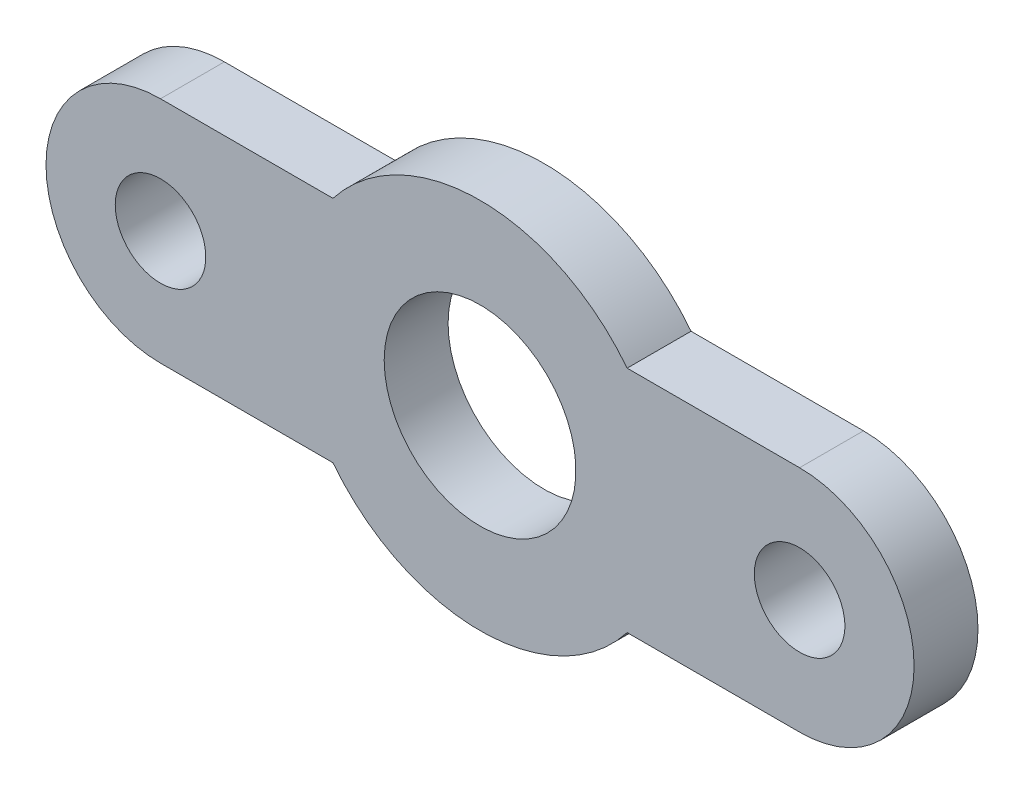
ISO-10303-21;
HEADER;
FILE_DESCRIPTION(('STEP AP214'),'2;1');
FILE_NAME('part.step','',(''),(''),'','','');
FILE_SCHEMA(('AUTOMOTIVE_DESIGN { 1 0 10303 214 1 1 1 1 }'));
ENDSEC;
DATA;
#1=APPLICATION_CONTEXT('core data for automotive mechanical design processes');
#2=APPLICATION_PROTOCOL_DEFINITION('international standard','automotive_design',2000,#1);
#3=PRODUCT_CONTEXT('',#1,'mechanical');
#4=PRODUCT('Part','Part','',(#3));
#5=PRODUCT_RELATED_PRODUCT_CATEGORY('part','',(#4));
#6=PRODUCT_DEFINITION_FORMATION('','',#4);
#7=PRODUCT_DEFINITION_CONTEXT('part definition',#1,'design');
#8=PRODUCT_DEFINITION('design','',#6,#7);
#9=PRODUCT_DEFINITION_SHAPE('','',#8);
#10=(LENGTH_UNIT() NAMED_UNIT(*) SI_UNIT(.MILLI.,.METRE.));
#11=(NAMED_UNIT(*) PLANE_ANGLE_UNIT() SI_UNIT($,.RADIAN.));
#12=(NAMED_UNIT(*) SI_UNIT($,.STERADIAN.) SOLID_ANGLE_UNIT());
#13=UNCERTAINTY_MEASURE_WITH_UNIT(LENGTH_MEASURE(1.E-05),#10,'distance_accuracy_value','');
#14=(GEOMETRIC_REPRESENTATION_CONTEXT(3) GLOBAL_UNCERTAINTY_ASSIGNED_CONTEXT((#13)) GLOBAL_UNIT_ASSIGNED_CONTEXT((#10,
#11,#12)) REPRESENTATION_CONTEXT('',''));
#15=CARTESIAN_POINT('',(0.,0.,0.));
#16=DIRECTION('',(0.,0.,1.));
#17=DIRECTION('',(1.,0.,0.));
#18=AXIS2_PLACEMENT_3D('',#15,#16,#17);
#19=CARTESIAN_POINT('',(12.,-4.3,2.4));
#20=DIRECTION('',(0.,1.,0.));
#21=DIRECTION('',(0.,0.,1.));
#22=AXIS2_PLACEMENT_3D('',#19,#20,#21);
#23=PLANE('',#22);
#24=DIRECTION('',(0.,0.,-1.));
#25=VECTOR('',#24,1.);
#26=CARTESIAN_POINT('',(5.52358579185659,-4.3,2.4));
#27=LINE('',#26,#25);
#28=CARTESIAN_POINT('',(5.52358579185659,-4.3,0.));
#29=VERTEX_POINT('',#28);
#30=CARTESIAN_POINT('',(5.52358579185659,-4.3,2.4));
#31=VERTEX_POINT('',#30);
#32=EDGE_CURVE('E142',#29,#31,#27,.F.);
#33=ORIENTED_EDGE('',*,*,#32,.F.);
#34=DIRECTION('',(1.,0.,0.));
#35=VECTOR('',#34,1.);
#36=CARTESIAN_POINT('',(12.,-4.3,0.));
#37=LINE('',#36,#35);
#38=CARTESIAN_POINT('',(12.,-4.3,0.));
#39=VERTEX_POINT('',#38);
#40=EDGE_CURVE('E157',#29,#39,#37,.T.);
#41=ORIENTED_EDGE('',*,*,#40,.T.);
#42=DIRECTION('',(0.,0.,-1.));
#43=VECTOR('',#42,1.);
#44=CARTESIAN_POINT('',(12.,-4.3,2.4));
#45=LINE('',#44,#43);
#46=CARTESIAN_POINT('',(12.,-4.3,2.4));
#47=VERTEX_POINT('',#46);
#48=EDGE_CURVE('E48',#47,#39,#45,.T.);
#49=ORIENTED_EDGE('',*,*,#48,.F.);
#50=DIRECTION('',(1.,0.,0.));
#51=VECTOR('',#50,1.);
#52=CARTESIAN_POINT('',(12.,-4.3,2.4));
#53=LINE('',#52,#51);
#54=EDGE_CURVE('E146',#31,#47,#53,.T.);
#55=ORIENTED_EDGE('',*,*,#54,.F.);
#56=EDGE_LOOP('',(#33,#41,#49,#55));
#57=FACE_BOUND('',#56,.T.);
#58=ADVANCED_FACE('F39',(#57),#23,.F.);
#59=DIRECTION('',(0.,0.,-1.));
#60=VECTOR('',#59,1.);
#61=CARTESIAN_POINT('',(-5.52358579185659,-4.3,2.4));
#62=LINE('',#61,#60);
#63=CARTESIAN_POINT('',(-5.52358579185659,-4.3,2.4));
#64=VERTEX_POINT('',#63);
#65=CARTESIAN_POINT('',(-5.52358579185659,-4.3,0.));
#66=VERTEX_POINT('',#65);
#67=EDGE_CURVE('E137',#64,#66,#62,.T.);
#68=ORIENTED_EDGE('',*,*,#67,.F.);
#69=CARTESIAN_POINT('',(-12.,-4.3,2.4));
#70=VERTEX_POINT('',#69);
#71=EDGE_CURVE('E149',#70,#64,#53,.T.);
#72=ORIENTED_EDGE('',*,*,#71,.F.);
#73=DIRECTION('',(0.,0.,-1.));
#74=VECTOR('',#73,1.);
#75=CARTESIAN_POINT('',(-12.,-4.3,2.4));
#76=LINE('',#75,#74);
#77=CARTESIAN_POINT('',(-12.,-4.3,0.));
#78=VERTEX_POINT('',#77);
#79=EDGE_CURVE('E11',#70,#78,#76,.T.);
#80=ORIENTED_EDGE('',*,*,#79,.T.);
#81=EDGE_CURVE('E159',#78,#66,#37,.T.);
#82=ORIENTED_EDGE('',*,*,#81,.T.);
#83=EDGE_LOOP('',(#68,#72,#80,#82));
#84=FACE_BOUND('',#83,.T.);
#85=ADVANCED_FACE('F205',(#84),#23,.F.);
#86=CARTESIAN_POINT('',(-12.,4.3,2.4));
#87=DIRECTION('',(0.,-1.,0.));
#88=DIRECTION('',(0.,0.,-1.));
#89=AXIS2_PLACEMENT_3D('',#86,#87,#88);
#90=PLANE('',#89);
#91=DIRECTION('',(0.,0.,-1.));
#92=VECTOR('',#91,1.);
#93=CARTESIAN_POINT('',(-5.52358579185659,4.3,2.4));
#94=LINE('',#93,#92);
#95=CARTESIAN_POINT('',(-5.52358579185659,4.3,0.));
#96=VERTEX_POINT('',#95);
#97=CARTESIAN_POINT('',(-5.52358579185659,4.3,2.4));
#98=VERTEX_POINT('',#97);
#99=EDGE_CURVE('E121',#96,#98,#94,.F.);
#100=ORIENTED_EDGE('',*,*,#99,.F.);
#101=DIRECTION('',(-1.,0.,0.));
#102=VECTOR('',#101,1.);
#103=CARTESIAN_POINT('',(-12.,4.3,0.));
#104=LINE('',#103,#102);
#105=CARTESIAN_POINT('',(-12.,4.3,0.));
#106=VERTEX_POINT('',#105);
#107=EDGE_CURVE('E111',#96,#106,#104,.T.);
#108=ORIENTED_EDGE('',*,*,#107,.T.);
#109=DIRECTION('',(0.,0.,-1.));
#110=VECTOR('',#109,1.);
#111=CARTESIAN_POINT('',(-12.,4.3,2.4));
#112=LINE('',#111,#110);
#113=CARTESIAN_POINT('',(-12.,4.3,2.4));
#114=VERTEX_POINT('',#113);
#115=EDGE_CURVE('E156',#114,#106,#112,.T.);
#116=ORIENTED_EDGE('',*,*,#115,.F.);
#117=DIRECTION('',(-1.,0.,0.));
#118=VECTOR('',#117,1.);
#119=CARTESIAN_POINT('',(-12.,4.3,2.4));
#120=LINE('',#119,#118);
#121=EDGE_CURVE('E57',#98,#114,#120,.T.);
#122=ORIENTED_EDGE('',*,*,#121,.F.);
#123=EDGE_LOOP('',(#100,#108,#116,#122));
#124=FACE_BOUND('',#123,.T.);
#125=ADVANCED_FACE('F208',(#124),#90,.F.);
#126=DIRECTION('',(0.,0.,-1.));
#127=VECTOR('',#126,1.);
#128=CARTESIAN_POINT('',(5.52358579185659,4.3,2.4));
#129=LINE('',#128,#127);
#130=CARTESIAN_POINT('',(5.52358579185659,4.3,2.4));
#131=VERTEX_POINT('',#130);
#132=CARTESIAN_POINT('',(5.52358579185659,4.3,0.));
#133=VERTEX_POINT('',#132);
#134=EDGE_CURVE('E65',#131,#133,#129,.T.);
#135=ORIENTED_EDGE('',*,*,#134,.F.);
#136=CARTESIAN_POINT('',(12.,4.3,2.4));
#137=VERTEX_POINT('',#136);
#138=EDGE_CURVE('E152',#137,#131,#120,.T.);
#139=ORIENTED_EDGE('',*,*,#138,.F.);
#140=DIRECTION('',(0.,0.,-1.));
#141=VECTOR('',#140,1.);
#142=CARTESIAN_POINT('',(12.,4.3,2.4));
#143=LINE('',#142,#141);
#144=CARTESIAN_POINT('',(12.,4.3,0.));
#145=VERTEX_POINT('',#144);
#146=EDGE_CURVE('E108',#137,#145,#143,.T.);
#147=ORIENTED_EDGE('',*,*,#146,.T.);
#148=EDGE_CURVE('E106',#145,#133,#104,.T.);
#149=ORIENTED_EDGE('',*,*,#148,.T.);
#150=EDGE_LOOP('',(#135,#139,#147,#149));
#151=FACE_BOUND('',#150,.T.);
#152=ADVANCED_FACE('F110',(#151),#90,.F.);
#153=CARTESIAN_POINT('',(-12.,0.,2.4));
#154=DIRECTION('',(0.,0.,-1.));
#155=DIRECTION('',(-1.,0.,0.));
#156=AXIS2_PLACEMENT_3D('',#153,#154,#155);
#157=CYLINDRICAL_SURFACE('',#156,4.3);
#158=CARTESIAN_POINT('',(-12.,0.,0.));
#159=DIRECTION('',(0.,0.,1.));
#160=DIRECTION('',(-1.,0.,0.));
#161=AXIS2_PLACEMENT_3D('',#158,#159,#160);
#162=CIRCLE('',#161,4.3);
#163=EDGE_CURVE('E144',#106,#78,#162,.T.);
#164=ORIENTED_EDGE('',*,*,#163,.T.);
#165=ORIENTED_EDGE('',*,*,#79,.F.);
#166=CARTESIAN_POINT('',(-12.,0.,2.4));
#167=DIRECTION('',(0.,0.,1.));
#168=DIRECTION('',(-1.,0.,0.));
#169=AXIS2_PLACEMENT_3D('',#166,#167,#168);
#170=CIRCLE('',#169,4.3);
#171=EDGE_CURVE('E114',#114,#70,#170,.T.);
#172=ORIENTED_EDGE('',*,*,#171,.F.);
#173=ORIENTED_EDGE('',*,*,#115,.T.);
#174=EDGE_LOOP('',(#164,#165,#172,#173));
#175=FACE_BOUND('',#174,.T.);
#176=ADVANCED_FACE('F41',(#175),#157,.T.);
#177=CARTESIAN_POINT('',(12.,0.,2.4));
#178=DIRECTION('',(0.,0.,-1.));
#179=DIRECTION('',(-1.,0.,0.));
#180=AXIS2_PLACEMENT_3D('',#177,#178,#179);
#181=CYLINDRICAL_SURFACE('',#180,4.3);
#182=CARTESIAN_POINT('',(12.,0.,0.));
#183=DIRECTION('',(0.,0.,1.));
#184=DIRECTION('',(-1.,0.,0.));
#185=AXIS2_PLACEMENT_3D('',#182,#183,#184);
#186=CIRCLE('',#185,4.3);
#187=EDGE_CURVE('E165',#39,#145,#186,.T.);
#188=ORIENTED_EDGE('',*,*,#187,.T.);
#189=ORIENTED_EDGE('',*,*,#146,.F.);
#190=CARTESIAN_POINT('',(12.,0.,2.4));
#191=DIRECTION('',(0.,0.,1.));
#192=DIRECTION('',(-1.,0.,0.));
#193=AXIS2_PLACEMENT_3D('',#190,#191,#192);
#194=CIRCLE('',#193,4.3);
#195=EDGE_CURVE('E155',#47,#137,#194,.T.);
#196=ORIENTED_EDGE('',*,*,#195,.F.);
#197=ORIENTED_EDGE('',*,*,#48,.T.);
#198=EDGE_LOOP('',(#188,#189,#196,#197));
#199=FACE_BOUND('',#198,.T.);
#200=ADVANCED_FACE('F211',(#199),#181,.T.);
#201=CARTESIAN_POINT('',(-12.,0.,2.4));
#202=DIRECTION('',(0.,0.,-1.));
#203=DIRECTION('',(-1.,0.,0.));
#204=AXIS2_PLACEMENT_3D('',#201,#202,#203);
#205=PLANE('',#204);
#206=CARTESIAN_POINT('',(12.,0.,2.4));
#207=DIRECTION('',(0.,0.,-1.));
#208=DIRECTION('',(-1.,0.,0.));
#209=AXIS2_PLACEMENT_3D('',#206,#207,#208);
#210=CIRCLE('',#209,1.7);
#211=CARTESIAN_POINT('',(10.3,0.,2.4));
#212=VERTEX_POINT('',#211);
#213=EDGE_CURVE('E131',#212,#212,#210,.F.);
#214=ORIENTED_EDGE('',*,*,#213,.F.);
#215=EDGE_LOOP('',(#214));
#216=FACE_BOUND('',#215,.T.);
#217=CARTESIAN_POINT('',(-12.,0.,2.4));
#218=DIRECTION('',(0.,0.,-1.));
#219=DIRECTION('',(-1.,0.,0.));
#220=AXIS2_PLACEMENT_3D('',#217,#218,#219);
#221=CIRCLE('',#220,1.7);
#222=CARTESIAN_POINT('',(-13.7,0.,2.4));
#223=VERTEX_POINT('',#222);
#224=EDGE_CURVE('E175',#223,#223,#221,.F.);
#225=ORIENTED_EDGE('',*,*,#224,.F.);
#226=EDGE_LOOP('',(#225));
#227=FACE_BOUND('',#226,.T.);
#228=CARTESIAN_POINT('',(0.,0.,2.4));
#229=DIRECTION('',(0.,0.,-1.));
#230=DIRECTION('',(-1.,0.,0.));
#231=AXIS2_PLACEMENT_3D('',#228,#229,#230);
#232=CIRCLE('',#231,3.6);
#233=CARTESIAN_POINT('',(-3.6,0.,2.4));
#234=VERTEX_POINT('',#233);
#235=EDGE_CURVE('E173',#234,#234,#232,.F.);
#236=ORIENTED_EDGE('',*,*,#235,.F.);
#237=EDGE_LOOP('',(#236));
#238=FACE_BOUND('',#237,.T.);
#239=ORIENTED_EDGE('',*,*,#138,.T.);
#240=CARTESIAN_POINT('',(0.,0.,2.4));
#241=DIRECTION('',(0.,0.,1.));
#242=DIRECTION('',(1.,0.,0.));
#243=AXIS2_PLACEMENT_3D('',#240,#241,#242);
#244=CIRCLE('',#243,7.);
#245=EDGE_CURVE('E125',#131,#98,#244,.T.);
#246=ORIENTED_EDGE('',*,*,#245,.T.);
#247=ORIENTED_EDGE('',*,*,#121,.T.);
#248=ORIENTED_EDGE('',*,*,#171,.T.);
#249=ORIENTED_EDGE('',*,*,#71,.T.);
#250=EDGE_CURVE('E129',#64,#31,#244,.T.);
#251=ORIENTED_EDGE('',*,*,#250,.T.);
#252=ORIENTED_EDGE('',*,*,#54,.T.);
#253=ORIENTED_EDGE('',*,*,#195,.T.);
#254=EDGE_LOOP('',(#239,#246,#247,#248,#249,#251,#252,#253));
#255=FACE_BOUND('',#254,.T.);
#256=ADVANCED_FACE('F213',(#216,#227,#238,#255),#205,.F.);
#257=CARTESIAN_POINT('',(-12.,0.,0.));
#258=DIRECTION('',(0.,0.,-1.));
#259=DIRECTION('',(-1.,0.,0.));
#260=AXIS2_PLACEMENT_3D('',#257,#258,#259);
#261=PLANE('',#260);
#262=CARTESIAN_POINT('',(12.,0.,0.));
#263=DIRECTION('',(0.,0.,-1.));
#264=DIRECTION('',(-1.,0.,0.));
#265=AXIS2_PLACEMENT_3D('',#262,#263,#264);
#266=CIRCLE('',#265,1.7);
#267=CARTESIAN_POINT('',(10.3,0.,0.));
#268=VERTEX_POINT('',#267);
#269=EDGE_CURVE('E43',#268,#268,#266,.F.);
#270=ORIENTED_EDGE('',*,*,#269,.T.);
#271=EDGE_LOOP('',(#270));
#272=FACE_BOUND('',#271,.T.);
#273=CARTESIAN_POINT('',(-12.,0.,0.));
#274=DIRECTION('',(0.,0.,-1.));
#275=DIRECTION('',(-1.,0.,0.));
#276=AXIS2_PLACEMENT_3D('',#273,#274,#275);
#277=CIRCLE('',#276,1.7);
#278=CARTESIAN_POINT('',(-13.7,0.,0.));
#279=VERTEX_POINT('',#278);
#280=EDGE_CURVE('E174',#279,#279,#277,.F.);
#281=ORIENTED_EDGE('',*,*,#280,.T.);
#282=EDGE_LOOP('',(#281));
#283=FACE_BOUND('',#282,.T.);
#284=CARTESIAN_POINT('',(0.,0.,0.));
#285=DIRECTION('',(0.,0.,-1.));
#286=DIRECTION('',(-1.,0.,0.));
#287=AXIS2_PLACEMENT_3D('',#284,#285,#286);
#288=CIRCLE('',#287,3.6);
#289=CARTESIAN_POINT('',(-3.6,0.,0.));
#290=VERTEX_POINT('',#289);
#291=EDGE_CURVE('E166',#290,#290,#288,.F.);
#292=ORIENTED_EDGE('',*,*,#291,.T.);
#293=EDGE_LOOP('',(#292));
#294=FACE_BOUND('',#293,.T.);
#295=ORIENTED_EDGE('',*,*,#40,.F.);
#296=CARTESIAN_POINT('',(0.,0.,0.));
#297=DIRECTION('',(0.,0.,1.));
#298=DIRECTION('',(1.,0.,0.));
#299=AXIS2_PLACEMENT_3D('',#296,#297,#298);
#300=CIRCLE('',#299,7.);
#301=EDGE_CURVE('E128',#66,#29,#300,.T.);
#302=ORIENTED_EDGE('',*,*,#301,.F.);
#303=ORIENTED_EDGE('',*,*,#81,.F.);
#304=ORIENTED_EDGE('',*,*,#163,.F.);
#305=ORIENTED_EDGE('',*,*,#107,.F.);
#306=EDGE_CURVE('E116',#133,#96,#300,.T.);
#307=ORIENTED_EDGE('',*,*,#306,.F.);
#308=ORIENTED_EDGE('',*,*,#148,.F.);
#309=ORIENTED_EDGE('',*,*,#187,.F.);
#310=EDGE_LOOP('',(#295,#302,#303,#304,#305,#307,#308,#309));
#311=FACE_BOUND('',#310,.T.);
#312=ADVANCED_FACE('F130',(#272,#283,#294,#311),#261,.T.);
#313=CARTESIAN_POINT('',(0.,0.,2.4));
#314=DIRECTION('',(0.,0.,-1.));
#315=DIRECTION('',(-1.,0.,0.));
#316=AXIS2_PLACEMENT_3D('',#313,#314,#315);
#317=CYLINDRICAL_SURFACE('',#316,7.);
#318=ORIENTED_EDGE('',*,*,#306,.T.);
#319=ORIENTED_EDGE('',*,*,#99,.T.);
#320=ORIENTED_EDGE('',*,*,#245,.F.);
#321=ORIENTED_EDGE('',*,*,#134,.T.);
#322=EDGE_LOOP('',(#318,#319,#320,#321));
#323=FACE_BOUND('',#322,.T.);
#324=ADVANCED_FACE('F120',(#323),#317,.T.);
#325=ORIENTED_EDGE('',*,*,#301,.T.);
#326=ORIENTED_EDGE('',*,*,#32,.T.);
#327=ORIENTED_EDGE('',*,*,#250,.F.);
#328=ORIENTED_EDGE('',*,*,#67,.T.);
#329=EDGE_LOOP('',(#325,#326,#327,#328));
#330=FACE_BOUND('',#329,.T.);
#331=ADVANCED_FACE('F225',(#330),#317,.T.);
#332=CARTESIAN_POINT('',(0.,0.,2.5));
#333=DIRECTION('',(0.,0.,-1.));
#334=DIRECTION('',(-1.,0.,0.));
#335=AXIS2_PLACEMENT_3D('',#332,#333,#334);
#336=CYLINDRICAL_SURFACE('',#335,3.6);
#337=ORIENTED_EDGE('',*,*,#291,.F.);
#338=EDGE_LOOP('',(#337));
#339=FACE_BOUND('',#338,.T.);
#340=ORIENTED_EDGE('',*,*,#235,.T.);
#341=EDGE_LOOP('',(#340));
#342=FACE_BOUND('',#341,.T.);
#343=ADVANCED_FACE('F197',(#339,#342),#336,.F.);
#344=CARTESIAN_POINT('',(-12.,0.,2.5));
#345=DIRECTION('',(0.,0.,-1.));
#346=DIRECTION('',(-1.,0.,0.));
#347=AXIS2_PLACEMENT_3D('',#344,#345,#346);
#348=CYLINDRICAL_SURFACE('',#347,1.7);
#349=ORIENTED_EDGE('',*,*,#280,.F.);
#350=EDGE_LOOP('',(#349));
#351=FACE_BOUND('',#350,.T.);
#352=ORIENTED_EDGE('',*,*,#224,.T.);
#353=EDGE_LOOP('',(#352));
#354=FACE_BOUND('',#353,.T.);
#355=ADVANCED_FACE('F195',(#351,#354),#348,.F.);
#356=CARTESIAN_POINT('',(12.,0.,2.5));
#357=DIRECTION('',(0.,0.,-1.));
#358=DIRECTION('',(-1.,0.,0.));
#359=AXIS2_PLACEMENT_3D('',#356,#357,#358);
#360=CYLINDRICAL_SURFACE('',#359,1.7);
#361=ORIENTED_EDGE('',*,*,#269,.F.);
#362=EDGE_LOOP('',(#361));
#363=FACE_BOUND('',#362,.T.);
#364=ORIENTED_EDGE('',*,*,#213,.T.);
#365=EDGE_LOOP('',(#364));
#366=FACE_BOUND('',#365,.T.);
#367=ADVANCED_FACE('F186',(#363,#366),#360,.F.);
#368=CLOSED_SHELL('',(#58,#85,#125,#152,#176,#200,#256,#312,#324,#331,#343,#355,#367));
#369=MANIFOLD_SOLID_BREP('B2',#368);
#370=ADVANCED_BREP_SHAPE_REPRESENTATION('',(#18,#369),#14);
#371=SHAPE_DEFINITION_REPRESENTATION(#9,#370);
ENDSEC;
END-ISO-10303-21;
